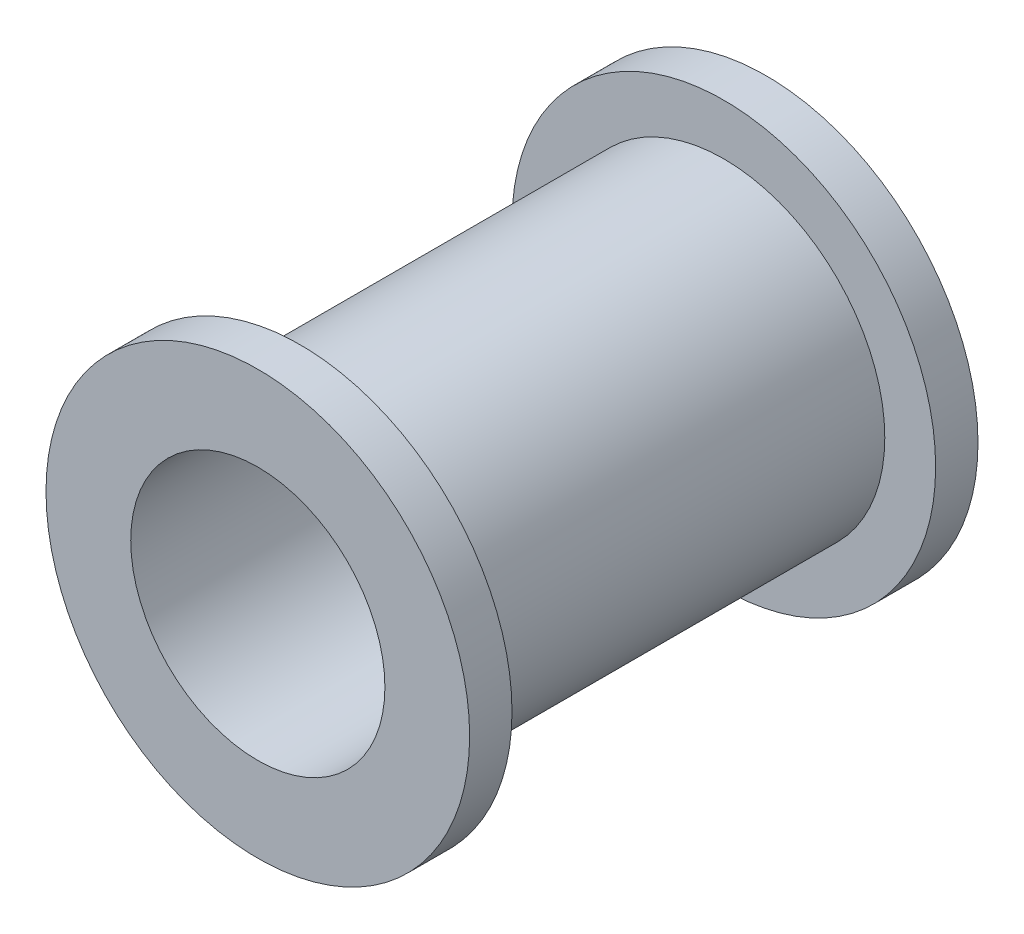
ISO-10303-21;
HEADER;
FILE_DESCRIPTION(('STEP AP214'),'2;1');
FILE_NAME('part.step','',(''),(''),'','','');
FILE_SCHEMA(('AUTOMOTIVE_DESIGN { 1 0 10303 214 1 1 1 1 }'));
ENDSEC;
DATA;
#1=APPLICATION_CONTEXT('core data for automotive mechanical design processes');
#2=APPLICATION_PROTOCOL_DEFINITION('international standard','automotive_design',2000,#1);
#3=PRODUCT_CONTEXT('',#1,'mechanical');
#4=PRODUCT('Part','Part','',(#3));
#5=PRODUCT_RELATED_PRODUCT_CATEGORY('part','',(#4));
#6=PRODUCT_DEFINITION_FORMATION('','',#4);
#7=PRODUCT_DEFINITION_CONTEXT('part definition',#1,'design');
#8=PRODUCT_DEFINITION('design','',#6,#7);
#9=PRODUCT_DEFINITION_SHAPE('','',#8);
#10=(LENGTH_UNIT() NAMED_UNIT(*) SI_UNIT(.MILLI.,.METRE.));
#11=(NAMED_UNIT(*) PLANE_ANGLE_UNIT() SI_UNIT($,.RADIAN.));
#12=(NAMED_UNIT(*) SI_UNIT($,.STERADIAN.) SOLID_ANGLE_UNIT());
#13=UNCERTAINTY_MEASURE_WITH_UNIT(LENGTH_MEASURE(1.E-05),#10,'distance_accuracy_value','');
#14=(GEOMETRIC_REPRESENTATION_CONTEXT(3) GLOBAL_UNCERTAINTY_ASSIGNED_CONTEXT((#13)) GLOBAL_UNIT_ASSIGNED_CONTEXT((#10,
#11,#12)) REPRESENTATION_CONTEXT('',''));
#15=CARTESIAN_POINT('',(0.,0.,0.));
#16=DIRECTION('',(0.,0.,1.));
#17=DIRECTION('',(1.,0.,0.));
#18=AXIS2_PLACEMENT_3D('',#15,#16,#17);
#19=CARTESIAN_POINT('',(0.,0.,50.));
#20=DIRECTION('',(0.,0.,-1.));
#21=DIRECTION('',(-1.,0.,0.));
#22=AXIS2_PLACEMENT_3D('',#19,#20,#21);
#23=CYLINDRICAL_SURFACE('',#22,19.);
#24=CARTESIAN_POINT('',(0.,0.,50.));
#25=DIRECTION('',(0.,0.,1.));
#26=DIRECTION('',(1.,0.,0.));
#27=AXIS2_PLACEMENT_3D('',#24,#25,#26);
#28=CIRCLE('',#27,19.);
#29=CARTESIAN_POINT('',(19.,0.,50.));
#30=VERTEX_POINT('',#29);
#31=EDGE_CURVE('E10',#30,#30,#28,.T.);
#32=ORIENTED_EDGE('',*,*,#31,.F.);
#33=EDGE_LOOP('',(#32));
#34=FACE_BOUND('',#33,.T.);
#35=CARTESIAN_POINT('',(0.,0.,0.));
#36=DIRECTION('',(0.,0.,-1.));
#37=DIRECTION('',(-1.,0.,0.));
#38=AXIS2_PLACEMENT_3D('',#35,#36,#37);
#39=CIRCLE('',#38,19.);
#40=CARTESIAN_POINT('',(-19.,0.,0.));
#41=VERTEX_POINT('',#40);
#42=EDGE_CURVE('E49',#41,#41,#39,.T.);
#43=ORIENTED_EDGE('',*,*,#42,.F.);
#44=EDGE_LOOP('',(#43));
#45=FACE_BOUND('',#44,.T.);
#46=ADVANCED_FACE('F30',(#34,#45),#23,.T.);
#47=CARTESIAN_POINT('',(0.,0.,50.));
#48=DIRECTION('',(0.,0.,-1.));
#49=DIRECTION('',(-1.,0.,0.));
#50=AXIS2_PLACEMENT_3D('',#47,#48,#49);
#51=CYLINDRICAL_SURFACE('',#50,15.);
#52=CARTESIAN_POINT('',(0.,0.,55.));
#53=DIRECTION('',(0.,0.,1.));
#54=DIRECTION('',(1.,0.,0.));
#55=AXIS2_PLACEMENT_3D('',#52,#53,#54);
#56=CIRCLE('',#55,15.);
#57=CARTESIAN_POINT('',(15.,0.,55.));
#58=VERTEX_POINT('',#57);
#59=EDGE_CURVE('E45',#58,#58,#56,.T.);
#60=ORIENTED_EDGE('',*,*,#59,.T.);
#61=EDGE_LOOP('',(#60));
#62=FACE_BOUND('',#61,.T.);
#63=CARTESIAN_POINT('',(0.,0.,-5.));
#64=DIRECTION('',(0.,0.,-1.));
#65=DIRECTION('',(-1.,0.,0.));
#66=AXIS2_PLACEMENT_3D('',#63,#64,#65);
#67=CIRCLE('',#66,15.);
#68=CARTESIAN_POINT('',(-15.,0.,-5.));
#69=VERTEX_POINT('',#68);
#70=EDGE_CURVE('E56',#69,#69,#67,.T.);
#71=ORIENTED_EDGE('',*,*,#70,.T.);
#72=EDGE_LOOP('',(#71));
#73=FACE_BOUND('',#72,.T.);
#74=ADVANCED_FACE('F62',(#62,#73),#51,.F.);
#75=CARTESIAN_POINT('',(0.,0.,50.));
#76=DIRECTION('',(0.,0.,1.));
#77=DIRECTION('',(1.,0.,0.));
#78=AXIS2_PLACEMENT_3D('',#75,#76,#77);
#79=PLANE('',#78);
#80=CARTESIAN_POINT('',(0.,0.,50.));
#81=DIRECTION('',(0.,0.,1.));
#82=DIRECTION('',(1.,0.,0.));
#83=AXIS2_PLACEMENT_3D('',#80,#81,#82);
#84=CIRCLE('',#83,25.);
#85=CARTESIAN_POINT('',(25.,0.,50.));
#86=VERTEX_POINT('',#85);
#87=EDGE_CURVE('E40',#86,#86,#84,.T.);
#88=ORIENTED_EDGE('',*,*,#87,.F.);
#89=EDGE_LOOP('',(#88));
#90=FACE_BOUND('',#89,.T.);
#91=ORIENTED_EDGE('',*,*,#31,.T.);
#92=EDGE_LOOP('',(#91));
#93=FACE_BOUND('',#92,.T.);
#94=ADVANCED_FACE('F84',(#90,#93),#79,.F.);
#95=CARTESIAN_POINT('',(0.,0.,55.));
#96=DIRECTION('',(0.,0.,1.));
#97=DIRECTION('',(1.,0.,0.));
#98=AXIS2_PLACEMENT_3D('',#95,#96,#97);
#99=PLANE('',#98);
#100=CARTESIAN_POINT('',(0.,0.,55.));
#101=DIRECTION('',(0.,0.,1.));
#102=DIRECTION('',(1.,0.,0.));
#103=AXIS2_PLACEMENT_3D('',#100,#101,#102);
#104=CIRCLE('',#103,25.);
#105=CARTESIAN_POINT('',(25.,0.,55.));
#106=VERTEX_POINT('',#105);
#107=EDGE_CURVE('E36',#106,#106,#104,.T.);
#108=ORIENTED_EDGE('',*,*,#107,.T.);
#109=EDGE_LOOP('',(#108));
#110=FACE_BOUND('',#109,.T.);
#111=ORIENTED_EDGE('',*,*,#59,.F.);
#112=EDGE_LOOP('',(#111));
#113=FACE_BOUND('',#112,.T.);
#114=ADVANCED_FACE('F92',(#110,#113),#99,.T.);
#115=CARTESIAN_POINT('',(0.,0.,55.));
#116=DIRECTION('',(0.,0.,-1.));
#117=DIRECTION('',(-1.,0.,0.));
#118=AXIS2_PLACEMENT_3D('',#115,#116,#117);
#119=CYLINDRICAL_SURFACE('',#118,25.);
#120=ORIENTED_EDGE('',*,*,#107,.F.);
#121=EDGE_LOOP('',(#120));
#122=FACE_BOUND('',#121,.T.);
#123=ORIENTED_EDGE('',*,*,#87,.T.);
#124=EDGE_LOOP('',(#123));
#125=FACE_BOUND('',#124,.T.);
#126=ADVANCED_FACE('F76',(#122,#125),#119,.T.);
#127=CARTESIAN_POINT('',(0.,0.,0.));
#128=DIRECTION('',(0.,0.,-1.));
#129=DIRECTION('',(-1.,0.,0.));
#130=AXIS2_PLACEMENT_3D('',#127,#128,#129);
#131=PLANE('',#130);
#132=CARTESIAN_POINT('',(0.,0.,0.));
#133=DIRECTION('',(0.,0.,-1.));
#134=DIRECTION('',(-1.,0.,0.));
#135=AXIS2_PLACEMENT_3D('',#132,#133,#134);
#136=CIRCLE('',#135,25.);
#137=CARTESIAN_POINT('',(-25.,0.,0.));
#138=VERTEX_POINT('',#137);
#139=EDGE_CURVE('E53',#138,#138,#136,.T.);
#140=ORIENTED_EDGE('',*,*,#139,.F.);
#141=EDGE_LOOP('',(#140));
#142=FACE_BOUND('',#141,.T.);
#143=ORIENTED_EDGE('',*,*,#42,.T.);
#144=EDGE_LOOP('',(#143));
#145=FACE_BOUND('',#144,.T.);
#146=ADVANCED_FACE('F67',(#142,#145),#131,.F.);
#147=CARTESIAN_POINT('',(0.,0.,-5.));
#148=DIRECTION('',(0.,0.,-1.));
#149=DIRECTION('',(-1.,0.,0.));
#150=AXIS2_PLACEMENT_3D('',#147,#148,#149);
#151=PLANE('',#150);
#152=CARTESIAN_POINT('',(0.,0.,-5.));
#153=DIRECTION('',(0.,0.,-1.));
#154=DIRECTION('',(-1.,0.,0.));
#155=AXIS2_PLACEMENT_3D('',#152,#153,#154);
#156=CIRCLE('',#155,25.);
#157=CARTESIAN_POINT('',(-25.,0.,-5.));
#158=VERTEX_POINT('',#157);
#159=EDGE_CURVE('E52',#158,#158,#156,.T.);
#160=ORIENTED_EDGE('',*,*,#159,.T.);
#161=EDGE_LOOP('',(#160));
#162=FACE_BOUND('',#161,.T.);
#163=ORIENTED_EDGE('',*,*,#70,.F.);
#164=EDGE_LOOP('',(#163));
#165=FACE_BOUND('',#164,.T.);
#166=ADVANCED_FACE('F64',(#162,#165),#151,.T.);
#167=CARTESIAN_POINT('',(0.,0.,-5.));
#168=DIRECTION('',(0.,0.,1.));
#169=DIRECTION('',(1.,0.,0.));
#170=AXIS2_PLACEMENT_3D('',#167,#168,#169);
#171=CYLINDRICAL_SURFACE('',#170,25.);
#172=ORIENTED_EDGE('',*,*,#159,.F.);
#173=EDGE_LOOP('',(#172));
#174=FACE_BOUND('',#173,.T.);
#175=ORIENTED_EDGE('',*,*,#139,.T.);
#176=EDGE_LOOP('',(#175));
#177=FACE_BOUND('',#176,.T.);
#178=ADVANCED_FACE('F66',(#174,#177),#171,.T.);
#179=CLOSED_SHELL('',(#46,#74,#94,#114,#126,#146,#166,#178));
#180=MANIFOLD_SOLID_BREP('B2',#179);
#181=ADVANCED_BREP_SHAPE_REPRESENTATION('',(#18,#180),#14);
#182=SHAPE_DEFINITION_REPRESENTATION(#9,#181);
ENDSEC;
END-ISO-10303-21;
